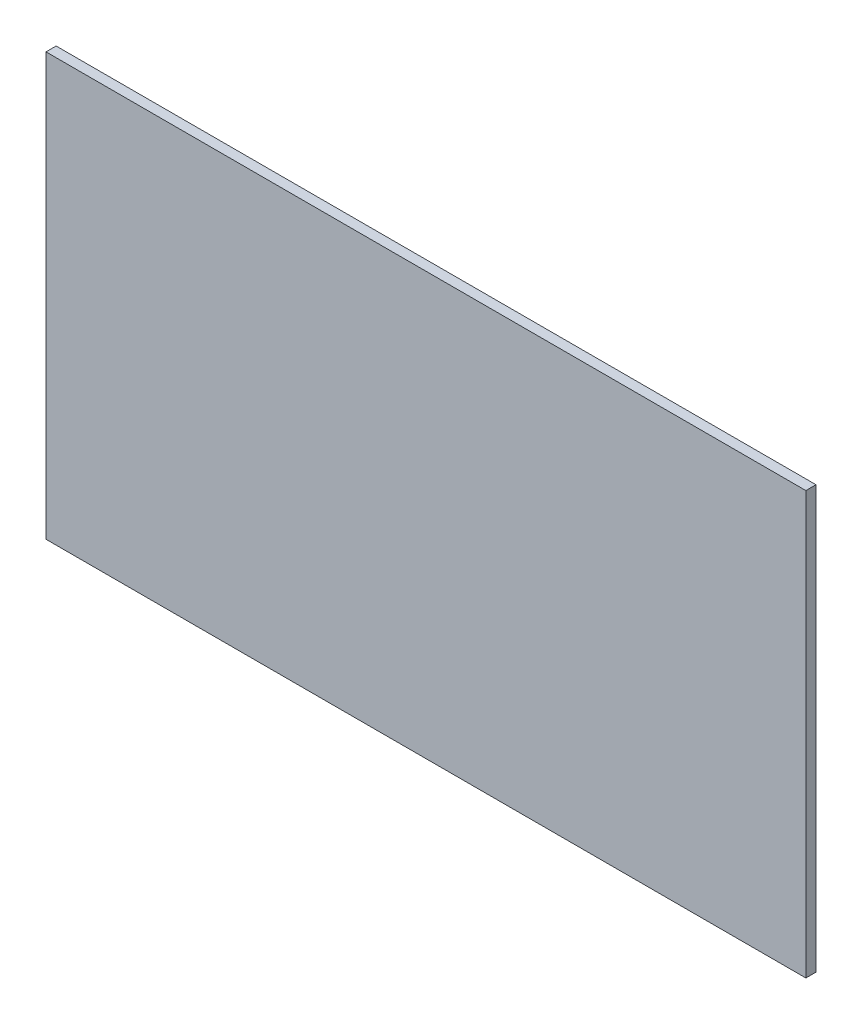
ISO-10303-21;
HEADER;
FILE_DESCRIPTION(('STEP AP214'),'2;1');
FILE_NAME('part.step','',(''),(''),'','','');
FILE_SCHEMA(('AUTOMOTIVE_DESIGN { 1 0 10303 214 1 1 1 1 }'));
ENDSEC;
DATA;
#1=APPLICATION_CONTEXT('core data for automotive mechanical design processes');
#2=APPLICATION_PROTOCOL_DEFINITION('international standard','automotive_design',2000,#1);
#3=PRODUCT_CONTEXT('',#1,'mechanical');
#4=PRODUCT('Part','Part','',(#3));
#5=PRODUCT_RELATED_PRODUCT_CATEGORY('part','',(#4));
#6=PRODUCT_DEFINITION_FORMATION('','',#4);
#7=PRODUCT_DEFINITION_CONTEXT('part definition',#1,'design');
#8=PRODUCT_DEFINITION('design','',#6,#7);
#9=PRODUCT_DEFINITION_SHAPE('','',#8);
#10=(LENGTH_UNIT() NAMED_UNIT(*) SI_UNIT(.MILLI.,.METRE.));
#11=(NAMED_UNIT(*) PLANE_ANGLE_UNIT() SI_UNIT($,.RADIAN.));
#12=(NAMED_UNIT(*) SI_UNIT($,.STERADIAN.) SOLID_ANGLE_UNIT());
#13=UNCERTAINTY_MEASURE_WITH_UNIT(LENGTH_MEASURE(1.E-05),#10,'distance_accuracy_value','');
#14=(GEOMETRIC_REPRESENTATION_CONTEXT(3) GLOBAL_UNCERTAINTY_ASSIGNED_CONTEXT((#13)) GLOBAL_UNIT_ASSIGNED_CONTEXT((#10,
#11,#12)) REPRESENTATION_CONTEXT('',''));
#15=CARTESIAN_POINT('',(0.,0.,0.));
#16=DIRECTION('',(0.,0.,1.));
#17=DIRECTION('',(1.,0.,0.));
#18=AXIS2_PLACEMENT_3D('',#15,#16,#17);
#19=CARTESIAN_POINT('',(-45.,25.,-1.2));
#20=DIRECTION('',(-1.,0.,0.));
#21=DIRECTION('',(0.,0.,1.));
#22=AXIS2_PLACEMENT_3D('',#19,#20,#21);
#23=PLANE('',#22);
#24=DIRECTION('',(0.,-1.,0.));
#25=VECTOR('',#24,1.);
#26=CARTESIAN_POINT('',(-45.,25.,0.));
#27=LINE('',#26,#25);
#28=CARTESIAN_POINT('',(-45.,25.,0.));
#29=VERTEX_POINT('',#28);
#30=CARTESIAN_POINT('',(-45.,-25.,0.));
#31=VERTEX_POINT('',#30);
#32=EDGE_CURVE('E125',#29,#31,#27,.T.);
#33=ORIENTED_EDGE('',*,*,#32,.F.);
#34=DIRECTION('',(0.,0.,1.));
#35=VECTOR('',#34,1.);
#36=CARTESIAN_POINT('',(-45.,25.,-1.2));
#37=LINE('',#36,#35);
#38=CARTESIAN_POINT('',(-45.,25.,-1.2));
#39=VERTEX_POINT('',#38);
#40=EDGE_CURVE('E11',#39,#29,#37,.T.);
#41=ORIENTED_EDGE('',*,*,#40,.F.);
#42=DIRECTION('',(0.,-1.,0.));
#43=VECTOR('',#42,1.);
#44=CARTESIAN_POINT('',(-45.,25.,-1.2));
#45=LINE('',#44,#43);
#46=CARTESIAN_POINT('',(-45.,-25.,-1.2));
#47=VERTEX_POINT('',#46);
#48=EDGE_CURVE('E116',#39,#47,#45,.T.);
#49=ORIENTED_EDGE('',*,*,#48,.T.);
#50=DIRECTION('',(0.,0.,1.));
#51=VECTOR('',#50,1.);
#52=CARTESIAN_POINT('',(-45.,-25.,-1.2));
#53=LINE('',#52,#51);
#54=EDGE_CURVE('E57',#47,#31,#53,.T.);
#55=ORIENTED_EDGE('',*,*,#54,.T.);
#56=EDGE_LOOP('',(#33,#41,#49,#55));
#57=FACE_BOUND('',#56,.T.);
#58=ADVANCED_FACE('F53',(#57),#23,.T.);
#59=CARTESIAN_POINT('',(45.,25.,-1.2));
#60=DIRECTION('',(0.,1.,0.));
#61=DIRECTION('',(0.,0.,1.));
#62=AXIS2_PLACEMENT_3D('',#59,#60,#61);
#63=PLANE('',#62);
#64=DIRECTION('',(-1.,0.,0.));
#65=VECTOR('',#64,1.);
#66=CARTESIAN_POINT('',(45.,25.,0.));
#67=LINE('',#66,#65);
#68=CARTESIAN_POINT('',(45.,25.,0.));
#69=VERTEX_POINT('',#68);
#70=EDGE_CURVE('E120',#69,#29,#67,.T.);
#71=ORIENTED_EDGE('',*,*,#70,.F.);
#72=DIRECTION('',(0.,0.,1.));
#73=VECTOR('',#72,1.);
#74=CARTESIAN_POINT('',(45.,25.,-1.2));
#75=LINE('',#74,#73);
#76=CARTESIAN_POINT('',(45.,25.,-1.2));
#77=VERTEX_POINT('',#76);
#78=EDGE_CURVE('E64',#77,#69,#75,.T.);
#79=ORIENTED_EDGE('',*,*,#78,.F.);
#80=DIRECTION('',(-1.,0.,0.));
#81=VECTOR('',#80,1.);
#82=CARTESIAN_POINT('',(45.,25.,-1.2));
#83=LINE('',#82,#81);
#84=EDGE_CURVE('E111',#77,#39,#83,.T.);
#85=ORIENTED_EDGE('',*,*,#84,.T.);
#86=ORIENTED_EDGE('',*,*,#40,.T.);
#87=EDGE_LOOP('',(#71,#79,#85,#86));
#88=FACE_BOUND('',#87,.T.);
#89=ADVANCED_FACE('F139',(#88),#63,.T.);
#90=CARTESIAN_POINT('',(45.,-25.,-1.2));
#91=DIRECTION('',(1.,0.,0.));
#92=DIRECTION('',(0.,0.,-1.));
#93=AXIS2_PLACEMENT_3D('',#90,#91,#92);
#94=PLANE('',#93);
#95=DIRECTION('',(0.,1.,0.));
#96=VECTOR('',#95,1.);
#97=CARTESIAN_POINT('',(45.,-25.,0.));
#98=LINE('',#97,#96);
#99=CARTESIAN_POINT('',(45.,-25.,0.));
#100=VERTEX_POINT('',#99);
#101=EDGE_CURVE('E105',#100,#69,#98,.T.);
#102=ORIENTED_EDGE('',*,*,#101,.F.);
#103=DIRECTION('',(0.,0.,1.));
#104=VECTOR('',#103,1.);
#105=CARTESIAN_POINT('',(45.,-25.,-1.2));
#106=LINE('',#105,#104);
#107=CARTESIAN_POINT('',(45.,-25.,-1.2));
#108=VERTEX_POINT('',#107);
#109=EDGE_CURVE('E100',#108,#100,#106,.T.);
#110=ORIENTED_EDGE('',*,*,#109,.F.);
#111=DIRECTION('',(0.,1.,0.));
#112=VECTOR('',#111,1.);
#113=CARTESIAN_POINT('',(45.,-25.,-1.2));
#114=LINE('',#113,#112);
#115=EDGE_CURVE('E103',#108,#77,#114,.T.);
#116=ORIENTED_EDGE('',*,*,#115,.T.);
#117=ORIENTED_EDGE('',*,*,#78,.T.);
#118=EDGE_LOOP('',(#102,#110,#116,#117));
#119=FACE_BOUND('',#118,.T.);
#120=ADVANCED_FACE('F102',(#119),#94,.T.);
#121=CARTESIAN_POINT('',(-45.,-25.,-1.2));
#122=DIRECTION('',(0.,-1.,0.));
#123=DIRECTION('',(0.,0.,-1.));
#124=AXIS2_PLACEMENT_3D('',#121,#122,#123);
#125=PLANE('',#124);
#126=DIRECTION('',(1.,0.,0.));
#127=VECTOR('',#126,1.);
#128=CARTESIAN_POINT('',(-45.,-25.,0.));
#129=LINE('',#128,#127);
#130=EDGE_CURVE('E129',#31,#100,#129,.T.);
#131=ORIENTED_EDGE('',*,*,#130,.F.);
#132=ORIENTED_EDGE('',*,*,#54,.F.);
#133=DIRECTION('',(1.,0.,0.));
#134=VECTOR('',#133,1.);
#135=CARTESIAN_POINT('',(-45.,-25.,-1.2));
#136=LINE('',#135,#134);
#137=EDGE_CURVE('E110',#47,#108,#136,.T.);
#138=ORIENTED_EDGE('',*,*,#137,.T.);
#139=ORIENTED_EDGE('',*,*,#109,.T.);
#140=EDGE_LOOP('',(#131,#132,#138,#139));
#141=FACE_BOUND('',#140,.T.);
#142=ADVANCED_FACE('F114',(#141),#125,.T.);
#143=CARTESIAN_POINT('',(0.,0.,-1.2));
#144=DIRECTION('',(0.,0.,1.));
#145=DIRECTION('',(1.,0.,0.));
#146=AXIS2_PLACEMENT_3D('',#143,#144,#145);
#147=PLANE('',#146);
#148=ORIENTED_EDGE('',*,*,#48,.F.);
#149=ORIENTED_EDGE('',*,*,#84,.F.);
#150=ORIENTED_EDGE('',*,*,#115,.F.);
#151=ORIENTED_EDGE('',*,*,#137,.F.);
#152=EDGE_LOOP('',(#148,#149,#150,#151));
#153=FACE_BOUND('',#152,.T.);
#154=ADVANCED_FACE('F109',(#153),#147,.F.);
#155=CARTESIAN_POINT('',(0.,0.,0.));
#156=DIRECTION('',(0.,0.,1.));
#157=DIRECTION('',(1.,0.,0.));
#158=AXIS2_PLACEMENT_3D('',#155,#156,#157);
#159=PLANE('',#158);
#160=ORIENTED_EDGE('',*,*,#32,.T.);
#161=ORIENTED_EDGE('',*,*,#130,.T.);
#162=ORIENTED_EDGE('',*,*,#101,.T.);
#163=ORIENTED_EDGE('',*,*,#70,.T.);
#164=EDGE_LOOP('',(#160,#161,#162,#163));
#165=FACE_BOUND('',#164,.T.);
#166=ADVANCED_FACE('F138',(#165),#159,.T.);
#167=CLOSED_SHELL('',(#58,#89,#120,#142,#154,#166));
#168=MANIFOLD_SOLID_BREP('B2',#167);
#169=ADVANCED_BREP_SHAPE_REPRESENTATION('',(#18,#168),#14);
#170=SHAPE_DEFINITION_REPRESENTATION(#9,#169);
ENDSEC;
END-ISO-10303-21;
